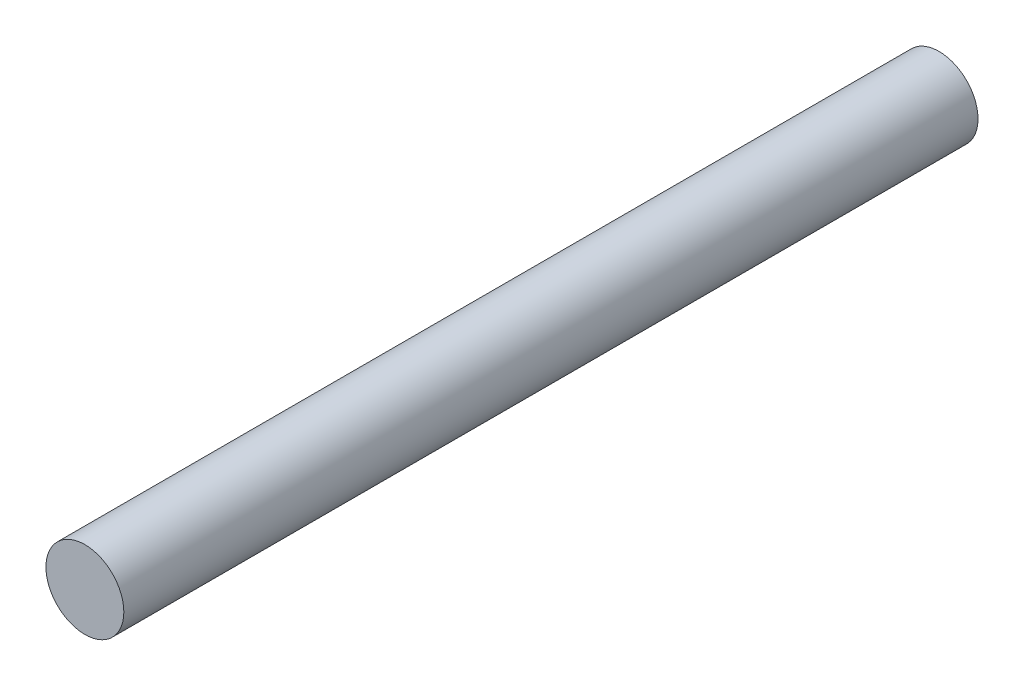
ISO-10303-21;
HEADER;
FILE_DESCRIPTION(('STEP AP214'),'2;1');
FILE_NAME('part.step','',(''),(''),'','','');
FILE_SCHEMA(('AUTOMOTIVE_DESIGN { 1 0 10303 214 1 1 1 1 }'));
ENDSEC;
DATA;
#1=APPLICATION_CONTEXT('core data for automotive mechanical design processes');
#2=APPLICATION_PROTOCOL_DEFINITION('international standard','automotive_design',2000,#1);
#3=PRODUCT_CONTEXT('',#1,'mechanical');
#4=PRODUCT('Part','Part','',(#3));
#5=PRODUCT_RELATED_PRODUCT_CATEGORY('part','',(#4));
#6=PRODUCT_DEFINITION_FORMATION('','',#4);
#7=PRODUCT_DEFINITION_CONTEXT('part definition',#1,'design');
#8=PRODUCT_DEFINITION('design','',#6,#7);
#9=PRODUCT_DEFINITION_SHAPE('','',#8);
#10=(LENGTH_UNIT() NAMED_UNIT(*) SI_UNIT(.MILLI.,.METRE.));
#11=(NAMED_UNIT(*) PLANE_ANGLE_UNIT() SI_UNIT($,.RADIAN.));
#12=(NAMED_UNIT(*) SI_UNIT($,.STERADIAN.) SOLID_ANGLE_UNIT());
#13=UNCERTAINTY_MEASURE_WITH_UNIT(LENGTH_MEASURE(1.E-05),#10,'distance_accuracy_value','');
#14=(GEOMETRIC_REPRESENTATION_CONTEXT(3) GLOBAL_UNCERTAINTY_ASSIGNED_CONTEXT((#13)) GLOBAL_UNIT_ASSIGNED_CONTEXT((#10,
#11,#12)) REPRESENTATION_CONTEXT('',''));
#15=CARTESIAN_POINT('',(0.,0.,0.));
#16=DIRECTION('',(0.,0.,1.));
#17=DIRECTION('',(1.,0.,0.));
#18=AXIS2_PLACEMENT_3D('',#15,#16,#17);
#19=CARTESIAN_POINT('',(0.,0.,200.));
#20=DIRECTION('',(0.,0.,-1.));
#21=DIRECTION('',(-1.,0.,0.));
#22=AXIS2_PLACEMENT_3D('',#19,#20,#21);
#23=CYLINDRICAL_SURFACE('',#22,9.12);
#24=CARTESIAN_POINT('',(0.,0.,200.));
#25=DIRECTION('',(0.,0.,1.));
#26=DIRECTION('',(1.,0.,0.));
#27=AXIS2_PLACEMENT_3D('',#24,#25,#26);
#28=CIRCLE('',#27,9.12);
#29=CARTESIAN_POINT('',(9.12,0.,200.));
#30=VERTEX_POINT('',#29);
#31=EDGE_CURVE('E10',#30,#30,#28,.T.);
#32=ORIENTED_EDGE('',*,*,#31,.F.);
#33=EDGE_LOOP('',(#32));
#34=FACE_BOUND('',#33,.T.);
#35=CARTESIAN_POINT('',(0.,0.,0.));
#36=DIRECTION('',(0.,0.,1.));
#37=DIRECTION('',(1.,0.,0.));
#38=AXIS2_PLACEMENT_3D('',#35,#36,#37);
#39=CIRCLE('',#38,9.12);
#40=CARTESIAN_POINT('',(9.12,0.,0.));
#41=VERTEX_POINT('',#40);
#42=EDGE_CURVE('E46',#41,#41,#39,.T.);
#43=ORIENTED_EDGE('',*,*,#42,.T.);
#44=EDGE_LOOP('',(#43));
#45=FACE_BOUND('',#44,.T.);
#46=ADVANCED_FACE('F43',(#34,#45),#23,.T.);
#47=CARTESIAN_POINT('',(0.,0.,200.));
#48=DIRECTION('',(0.,0.,1.));
#49=DIRECTION('',(1.,0.,0.));
#50=AXIS2_PLACEMENT_3D('',#47,#48,#49);
#51=PLANE('',#50);
#52=ORIENTED_EDGE('',*,*,#31,.T.);
#53=EDGE_LOOP('',(#52));
#54=FACE_BOUND('',#53,.T.);
#55=ADVANCED_FACE('F60',(#54),#51,.T.);
#56=CARTESIAN_POINT('',(0.,0.,0.));
#57=DIRECTION('',(0.,0.,1.));
#58=DIRECTION('',(1.,0.,0.));
#59=AXIS2_PLACEMENT_3D('',#56,#57,#58);
#60=PLANE('',#59);
#61=ORIENTED_EDGE('',*,*,#42,.F.);
#62=EDGE_LOOP('',(#61));
#63=FACE_BOUND('',#62,.T.);
#64=ADVANCED_FACE('F58',(#63),#60,.F.);
#65=CLOSED_SHELL('',(#46,#55,#64));
#66=MANIFOLD_SOLID_BREP('B2',#65);
#67=ADVANCED_BREP_SHAPE_REPRESENTATION('',(#18,#66),#14);
#68=SHAPE_DEFINITION_REPRESENTATION(#9,#67);
ENDSEC;
END-ISO-10303-21;
